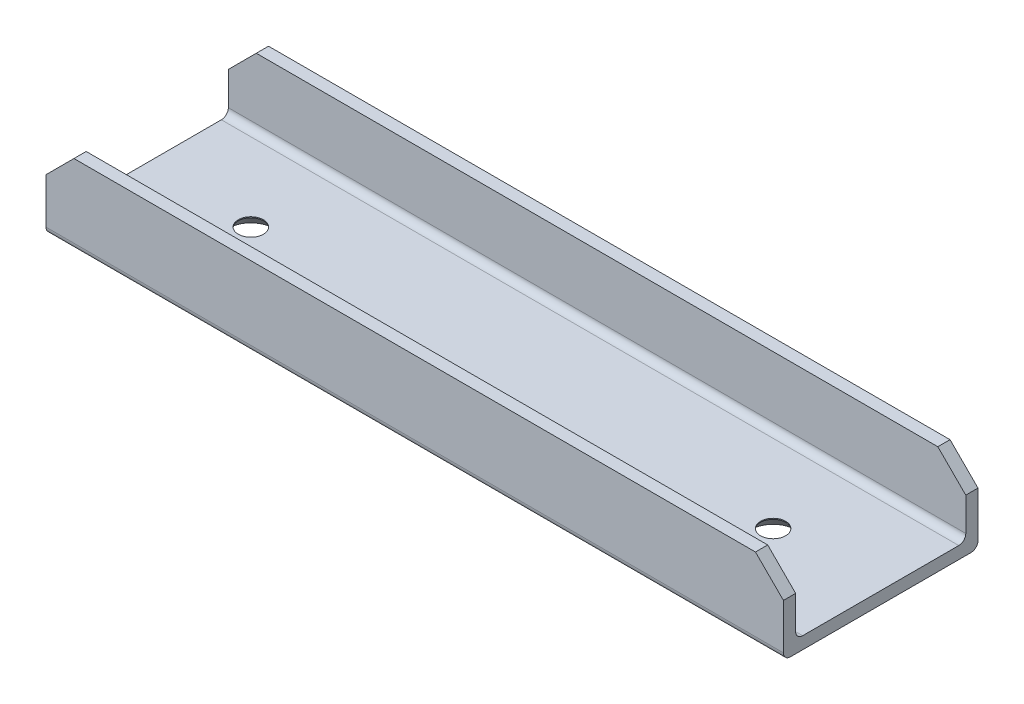
ISO-10303-21;
HEADER;
FILE_DESCRIPTION(('STEP AP214'),'2;1');
FILE_NAME('part.step','',(''),(''),'','','');
FILE_SCHEMA(('AUTOMOTIVE_DESIGN { 1 0 10303 214 1 1 1 1 }'));
ENDSEC;
DATA;
#1=APPLICATION_CONTEXT('core data for automotive mechanical design processes');
#2=APPLICATION_PROTOCOL_DEFINITION('international standard','automotive_design',2000,#1);
#3=PRODUCT_CONTEXT('',#1,'mechanical');
#4=PRODUCT('Part','Part','',(#3));
#5=PRODUCT_RELATED_PRODUCT_CATEGORY('part','',(#4));
#6=PRODUCT_DEFINITION_FORMATION('','',#4);
#7=PRODUCT_DEFINITION_CONTEXT('part definition',#1,'design');
#8=PRODUCT_DEFINITION('design','',#6,#7);
#9=PRODUCT_DEFINITION_SHAPE('','',#8);
#10=(LENGTH_UNIT() NAMED_UNIT(*) SI_UNIT(.MILLI.,.METRE.));
#11=(NAMED_UNIT(*) PLANE_ANGLE_UNIT() SI_UNIT($,.RADIAN.));
#12=(NAMED_UNIT(*) SI_UNIT($,.STERADIAN.) SOLID_ANGLE_UNIT());
#13=UNCERTAINTY_MEASURE_WITH_UNIT(LENGTH_MEASURE(1.E-05),#10,'distance_accuracy_value','');
#14=(GEOMETRIC_REPRESENTATION_CONTEXT(3) GLOBAL_UNCERTAINTY_ASSIGNED_CONTEXT((#13)) GLOBAL_UNIT_ASSIGNED_CONTEXT((#10,
#11,#12)) REPRESENTATION_CONTEXT('',''));
#15=CARTESIAN_POINT('',(0.,0.,0.));
#16=DIRECTION('',(0.,0.,1.));
#17=DIRECTION('',(1.,0.,0.));
#18=AXIS2_PLACEMENT_3D('',#15,#16,#17);
#19=CARTESIAN_POINT('',(0.,11.5,0.));
#20=DIRECTION('',(0.,-1.,0.));
#21=DIRECTION('',(0.,0.,-1.));
#22=AXIS2_PLACEMENT_3D('',#19,#20,#21);
#23=PLANE('',#22);
#24=DIRECTION('',(-1.,0.,0.));
#25=VECTOR('',#24,1.);
#26=CARTESIAN_POINT('',(-52.775,11.5,-13.925));
#27=LINE('',#26,#25);
#28=CARTESIAN_POINT('',(48.775,11.5,-13.925));
#29=VERTEX_POINT('',#28);
#30=CARTESIAN_POINT('',(-48.775,11.5,-13.925));
#31=VERTEX_POINT('',#30);
#32=EDGE_CURVE('E331',#29,#31,#27,.T.);
#33=ORIENTED_EDGE('',*,*,#32,.T.);
#34=DIRECTION('',(0.,0.,1.));
#35=VECTOR('',#34,1.);
#36=CARTESIAN_POINT('',(-48.775,11.5,0.));
#37=LINE('',#36,#35);
#38=CARTESIAN_POINT('',(-48.775,11.5,-12.175));
#39=VERTEX_POINT('',#38);
#40=EDGE_CURVE('E181',#31,#39,#37,.T.);
#41=ORIENTED_EDGE('',*,*,#40,.T.);
#42=DIRECTION('',(-1.,0.,0.));
#43=VECTOR('',#42,1.);
#44=CARTESIAN_POINT('',(-52.775,11.5,-12.175));
#45=LINE('',#44,#43);
#46=CARTESIAN_POINT('',(48.775,11.5,-12.175));
#47=VERTEX_POINT('',#46);
#48=EDGE_CURVE('E172',#47,#39,#45,.T.);
#49=ORIENTED_EDGE('',*,*,#48,.F.);
#50=DIRECTION('',(0.,0.,-1.));
#51=VECTOR('',#50,1.);
#52=CARTESIAN_POINT('',(48.775,11.5,0.));
#53=LINE('',#52,#51);
#54=EDGE_CURVE('E187',#47,#29,#53,.T.);
#55=ORIENTED_EDGE('',*,*,#54,.T.);
#56=EDGE_LOOP('',(#33,#41,#49,#55));
#57=FACE_BOUND('',#56,.T.);
#58=ADVANCED_FACE('F49',(#57),#23,.F.);
#59=CARTESIAN_POINT('',(52.775,11.5,13.925));
#60=DIRECTION('',(-1.,0.,0.));
#61=DIRECTION('',(0.,0.,1.));
#62=AXIS2_PLACEMENT_3D('',#59,#60,#61);
#63=PLANE('',#62);
#64=DIRECTION('',(0.,0.,-1.));
#65=VECTOR('',#64,1.);
#66=CARTESIAN_POINT('',(52.775,0.,13.925));
#67=LINE('',#66,#65);
#68=CARTESIAN_POINT('',(52.775,0.,12.925));
#69=VERTEX_POINT('',#68);
#70=CARTESIAN_POINT('',(52.775,0.,-12.925));
#71=VERTEX_POINT('',#70);
#72=EDGE_CURVE('E330',#69,#71,#67,.T.);
#73=ORIENTED_EDGE('',*,*,#72,.T.);
#74=CARTESIAN_POINT('',(52.775,1.,-12.925));
#75=DIRECTION('',(-1.,0.,0.));
#76=DIRECTION('',(0.,0.,1.));
#77=AXIS2_PLACEMENT_3D('',#74,#75,#76);
#78=CIRCLE('',#77,1.);
#79=CARTESIAN_POINT('',(52.775,1.,-13.925));
#80=VERTEX_POINT('',#79);
#81=EDGE_CURVE('E279',#71,#80,#78,.F.);
#82=ORIENTED_EDGE('',*,*,#81,.T.);
#83=DIRECTION('',(0.,-1.,0.));
#84=VECTOR('',#83,1.);
#85=CARTESIAN_POINT('',(52.775,11.5,-13.925));
#86=LINE('',#85,#84);
#87=CARTESIAN_POINT('',(52.775,7.50000000000001,-13.925));
#88=VERTEX_POINT('',#87);
#89=EDGE_CURVE('E197',#88,#80,#86,.T.);
#90=ORIENTED_EDGE('',*,*,#89,.F.);
#91=DIRECTION('',(0.,0.,1.));
#92=VECTOR('',#91,1.);
#93=CARTESIAN_POINT('',(52.775,7.50000000000001,13.925));
#94=LINE('',#93,#92);
#95=CARTESIAN_POINT('',(52.775,7.50000000000001,-12.175));
#96=VERTEX_POINT('',#95);
#97=EDGE_CURVE('E245',#88,#96,#94,.T.);
#98=ORIENTED_EDGE('',*,*,#97,.T.);
#99=DIRECTION('',(0.,1.,0.));
#100=VECTOR('',#99,1.);
#101=CARTESIAN_POINT('',(52.775,-108.322319953,-12.175));
#102=LINE('',#101,#100);
#103=CARTESIAN_POINT('',(52.775,2.75,-12.175));
#104=VERTEX_POINT('',#103);
#105=EDGE_CURVE('E174',#104,#96,#102,.T.);
#106=ORIENTED_EDGE('',*,*,#105,.F.);
#107=CARTESIAN_POINT('',(52.775,2.75,-11.175));
#108=DIRECTION('',(-1.,0.,0.));
#109=DIRECTION('',(0.,0.,1.));
#110=AXIS2_PLACEMENT_3D('',#107,#108,#109);
#111=CIRCLE('',#110,1.);
#112=CARTESIAN_POINT('',(52.775,1.75,-11.175));
#113=VERTEX_POINT('',#112);
#114=EDGE_CURVE('E288',#104,#113,#111,.T.);
#115=ORIENTED_EDGE('',*,*,#114,.T.);
#116=DIRECTION('',(0.,0.,-1.));
#117=VECTOR('',#116,1.);
#118=CARTESIAN_POINT('',(52.775,1.75,12.175));
#119=LINE('',#118,#117);
#120=CARTESIAN_POINT('',(52.775,1.75,11.175));
#121=VERTEX_POINT('',#120);
#122=EDGE_CURVE('E312',#121,#113,#119,.T.);
#123=ORIENTED_EDGE('',*,*,#122,.F.);
#124=CARTESIAN_POINT('',(52.775,2.75,11.175));
#125=DIRECTION('',(-1.,0.,0.));
#126=DIRECTION('',(0.,0.,1.));
#127=AXIS2_PLACEMENT_3D('',#124,#125,#126);
#128=CIRCLE('',#127,1.);
#129=CARTESIAN_POINT('',(52.775,2.75,12.175));
#130=VERTEX_POINT('',#129);
#131=EDGE_CURVE('E59',#121,#130,#128,.T.);
#132=ORIENTED_EDGE('',*,*,#131,.T.);
#133=DIRECTION('',(0.,1.,0.));
#134=VECTOR('',#133,1.);
#135=CARTESIAN_POINT('',(52.775,-108.322319953,12.175));
#136=LINE('',#135,#134);
#137=CARTESIAN_POINT('',(52.775,7.50000000000001,12.175));
#138=VERTEX_POINT('',#137);
#139=EDGE_CURVE('E316',#130,#138,#136,.T.);
#140=ORIENTED_EDGE('',*,*,#139,.T.);
#141=DIRECTION('',(0.,0.,1.));
#142=VECTOR('',#141,1.);
#143=CARTESIAN_POINT('',(52.775,7.50000000000001,13.925));
#144=LINE('',#143,#142);
#145=CARTESIAN_POINT('',(52.775,7.50000000000001,13.925));
#146=VERTEX_POINT('',#145);
#147=EDGE_CURVE('E242',#138,#146,#144,.T.);
#148=ORIENTED_EDGE('',*,*,#147,.T.);
#149=DIRECTION('',(0.,-1.,0.));
#150=VECTOR('',#149,1.);
#151=CARTESIAN_POINT('',(52.775,11.5,13.925));
#152=LINE('',#151,#150);
#153=CARTESIAN_POINT('',(52.775,1.,13.925));
#154=VERTEX_POINT('',#153);
#155=EDGE_CURVE('E339',#146,#154,#152,.T.);
#156=ORIENTED_EDGE('',*,*,#155,.T.);
#157=CARTESIAN_POINT('',(52.775,1.,12.925));
#158=DIRECTION('',(-1.,0.,0.));
#159=DIRECTION('',(0.,0.,1.));
#160=AXIS2_PLACEMENT_3D('',#157,#158,#159);
#161=CIRCLE('',#160,1.);
#162=EDGE_CURVE('E67',#154,#69,#161,.F.);
#163=ORIENTED_EDGE('',*,*,#162,.T.);
#164=EDGE_LOOP('',(#73,#82,#90,#98,#106,#115,#123,#132,#140,#148,#156,#163));
#165=FACE_BOUND('',#164,.T.);
#166=ADVANCED_FACE('F370',(#165),#63,.F.);
#167=CARTESIAN_POINT('',(-52.775,11.5,-13.925));
#168=DIRECTION('',(0.,0.,1.));
#169=DIRECTION('',(1.,0.,0.));
#170=AXIS2_PLACEMENT_3D('',#167,#168,#169);
#171=PLANE('',#170);
#172=ORIENTED_EDGE('',*,*,#89,.T.);
#173=DIRECTION('',(-1.,0.,0.));
#174=VECTOR('',#173,1.);
#175=CARTESIAN_POINT('',(-52.775,1.,-13.925));
#176=LINE('',#175,#174);
#177=CARTESIAN_POINT('',(-52.775,1.,-13.925));
#178=VERTEX_POINT('',#177);
#179=EDGE_CURVE('E262',#80,#178,#176,.T.);
#180=ORIENTED_EDGE('',*,*,#179,.T.);
#181=DIRECTION('',(0.,-1.,0.));
#182=VECTOR('',#181,1.);
#183=CARTESIAN_POINT('',(-52.775,11.5,-13.925));
#184=LINE('',#183,#182);
#185=CARTESIAN_POINT('',(-52.775,7.50000000000001,-13.925));
#186=VERTEX_POINT('',#185);
#187=EDGE_CURVE('E203',#186,#178,#184,.T.);
#188=ORIENTED_EDGE('',*,*,#187,.F.);
#189=DIRECTION('',(-0.707106781186546,-0.707106781186549,0.));
#190=VECTOR('',#189,1.);
#191=CARTESIAN_POINT('',(-48.775,11.5,-13.925));
#192=LINE('',#191,#190);
#193=EDGE_CURVE('E218',#186,#31,#192,.F.);
#194=ORIENTED_EDGE('',*,*,#193,.T.);
#195=ORIENTED_EDGE('',*,*,#32,.F.);
#196=DIRECTION('',(-0.707106781186546,0.707106781186549,0.));
#197=VECTOR('',#196,1.);
#198=CARTESIAN_POINT('',(48.775,11.5,-13.925));
#199=LINE('',#198,#197);
#200=EDGE_CURVE('E195',#29,#88,#199,.F.);
#201=ORIENTED_EDGE('',*,*,#200,.T.);
#202=EDGE_LOOP('',(#172,#180,#188,#194,#195,#201));
#203=FACE_BOUND('',#202,.T.);
#204=ADVANCED_FACE('F359',(#203),#171,.F.);
#205=CARTESIAN_POINT('',(-52.775,11.5,13.925));
#206=DIRECTION('',(1.,0.,0.));
#207=DIRECTION('',(0.,0.,-1.));
#208=AXIS2_PLACEMENT_3D('',#205,#206,#207);
#209=PLANE('',#208);
#210=ORIENTED_EDGE('',*,*,#187,.T.);
#211=CARTESIAN_POINT('',(-52.775,1.,-12.925));
#212=DIRECTION('',(1.,0.,0.));
#213=DIRECTION('',(0.,0.,-1.));
#214=AXIS2_PLACEMENT_3D('',#211,#212,#213);
#215=CIRCLE('',#214,1.);
#216=CARTESIAN_POINT('',(-52.775,0.,-12.925));
#217=VERTEX_POINT('',#216);
#218=EDGE_CURVE('E269',#178,#217,#215,.F.);
#219=ORIENTED_EDGE('',*,*,#218,.T.);
#220=DIRECTION('',(0.,0.,1.));
#221=VECTOR('',#220,1.);
#222=CARTESIAN_POINT('',(-52.775,0.,13.925));
#223=LINE('',#222,#221);
#224=CARTESIAN_POINT('',(-52.775,0.,12.925));
#225=VERTEX_POINT('',#224);
#226=EDGE_CURVE('E335',#217,#225,#223,.T.);
#227=ORIENTED_EDGE('',*,*,#226,.T.);
#228=CARTESIAN_POINT('',(-52.775,1.,12.925));
#229=DIRECTION('',(1.,0.,0.));
#230=DIRECTION('',(0.,0.,-1.));
#231=AXIS2_PLACEMENT_3D('',#228,#229,#230);
#232=CIRCLE('',#231,1.);
#233=CARTESIAN_POINT('',(-52.775,1.,13.925));
#234=VERTEX_POINT('',#233);
#235=EDGE_CURVE('E266',#225,#234,#232,.F.);
#236=ORIENTED_EDGE('',*,*,#235,.T.);
#237=DIRECTION('',(0.,-1.,0.));
#238=VECTOR('',#237,1.);
#239=CARTESIAN_POINT('',(-52.775,11.5,13.925));
#240=LINE('',#239,#238);
#241=CARTESIAN_POINT('',(-52.775,7.50000000000001,13.925));
#242=VERTEX_POINT('',#241);
#243=EDGE_CURVE('E348',#242,#234,#240,.T.);
#244=ORIENTED_EDGE('',*,*,#243,.F.);
#245=DIRECTION('',(0.,0.,-1.));
#246=VECTOR('',#245,1.);
#247=CARTESIAN_POINT('',(-52.775,7.50000000000001,13.925));
#248=LINE('',#247,#246);
#249=CARTESIAN_POINT('',(-52.775,7.50000000000001,12.175));
#250=VERTEX_POINT('',#249);
#251=EDGE_CURVE('E209',#242,#250,#248,.T.);
#252=ORIENTED_EDGE('',*,*,#251,.T.);
#253=DIRECTION('',(0.,1.,0.));
#254=VECTOR('',#253,1.);
#255=CARTESIAN_POINT('',(-52.775,-108.322319953,12.175));
#256=LINE('',#255,#254);
#257=CARTESIAN_POINT('',(-52.775,2.75,12.175));
#258=VERTEX_POINT('',#257);
#259=EDGE_CURVE('E321',#258,#250,#256,.T.);
#260=ORIENTED_EDGE('',*,*,#259,.F.);
#261=CARTESIAN_POINT('',(-52.775,2.75,11.175));
#262=DIRECTION('',(1.,0.,0.));
#263=DIRECTION('',(0.,0.,-1.));
#264=AXIS2_PLACEMENT_3D('',#261,#262,#263);
#265=CIRCLE('',#264,1.);
#266=CARTESIAN_POINT('',(-52.775,1.75,11.175));
#267=VERTEX_POINT('',#266);
#268=EDGE_CURVE('E12',#258,#267,#265,.T.);
#269=ORIENTED_EDGE('',*,*,#268,.T.);
#270=DIRECTION('',(0.,0.,1.));
#271=VECTOR('',#270,1.);
#272=CARTESIAN_POINT('',(-52.775,1.75,12.175));
#273=LINE('',#272,#271);
#274=CARTESIAN_POINT('',(-52.775,1.75,-11.175));
#275=VERTEX_POINT('',#274);
#276=EDGE_CURVE('E317',#275,#267,#273,.T.);
#277=ORIENTED_EDGE('',*,*,#276,.F.);
#278=CARTESIAN_POINT('',(-52.775,2.75,-11.175));
#279=DIRECTION('',(1.,0.,0.));
#280=DIRECTION('',(0.,0.,-1.));
#281=AXIS2_PLACEMENT_3D('',#278,#279,#280);
#282=CIRCLE('',#281,1.);
#283=CARTESIAN_POINT('',(-52.775,2.75,-12.175));
#284=VERTEX_POINT('',#283);
#285=EDGE_CURVE('E285',#275,#284,#282,.T.);
#286=ORIENTED_EDGE('',*,*,#285,.T.);
#287=DIRECTION('',(0.,1.,0.));
#288=VECTOR('',#287,1.);
#289=CARTESIAN_POINT('',(-52.775,-108.322319953,-12.175));
#290=LINE('',#289,#288);
#291=CARTESIAN_POINT('',(-52.775,7.50000000000001,-12.175));
#292=VERTEX_POINT('',#291);
#293=EDGE_CURVE('E310',#284,#292,#290,.T.);
#294=ORIENTED_EDGE('',*,*,#293,.T.);
#295=DIRECTION('',(0.,0.,-1.));
#296=VECTOR('',#295,1.);
#297=CARTESIAN_POINT('',(-52.775,7.50000000000001,13.925));
#298=LINE('',#297,#296);
#299=EDGE_CURVE('E213',#292,#186,#298,.T.);
#300=ORIENTED_EDGE('',*,*,#299,.T.);
#301=EDGE_LOOP('',(#210,#219,#227,#236,#244,#252,#260,#269,#277,#286,#294,#300));
#302=FACE_BOUND('',#301,.T.);
#303=ADVANCED_FACE('F355',(#302),#209,.F.);
#304=CARTESIAN_POINT('',(-52.775,11.5,13.925));
#305=DIRECTION('',(0.,0.,-1.));
#306=DIRECTION('',(-1.,0.,0.));
#307=AXIS2_PLACEMENT_3D('',#304,#305,#306);
#308=PLANE('',#307);
#309=ORIENTED_EDGE('',*,*,#243,.T.);
#310=DIRECTION('',(1.,0.,0.));
#311=VECTOR('',#310,1.);
#312=CARTESIAN_POINT('',(52.775,1.,13.925));
#313=LINE('',#312,#311);
#314=EDGE_CURVE('E282',#234,#154,#313,.T.);
#315=ORIENTED_EDGE('',*,*,#314,.T.);
#316=ORIENTED_EDGE('',*,*,#155,.F.);
#317=DIRECTION('',(0.707106781186546,-0.707106781186549,0.));
#318=VECTOR('',#317,1.);
#319=CARTESIAN_POINT('',(48.775,11.5,13.925));
#320=LINE('',#319,#318);
#321=CARTESIAN_POINT('',(48.775,11.5,13.925));
#322=VERTEX_POINT('',#321);
#323=EDGE_CURVE('E229',#146,#322,#320,.F.);
#324=ORIENTED_EDGE('',*,*,#323,.T.);
#325=DIRECTION('',(1.,0.,0.));
#326=VECTOR('',#325,1.);
#327=CARTESIAN_POINT('',(-52.775,11.5,13.925));
#328=LINE('',#327,#326);
#329=CARTESIAN_POINT('',(-48.775,11.5,13.925));
#330=VERTEX_POINT('',#329);
#331=EDGE_CURVE('E334',#330,#322,#328,.T.);
#332=ORIENTED_EDGE('',*,*,#331,.F.);
#333=DIRECTION('',(0.707106781186546,0.707106781186549,0.));
#334=VECTOR('',#333,1.);
#335=CARTESIAN_POINT('',(-48.775,11.5,13.925));
#336=LINE('',#335,#334);
#337=EDGE_CURVE('E232',#330,#242,#336,.F.);
#338=ORIENTED_EDGE('',*,*,#337,.T.);
#339=EDGE_LOOP('',(#309,#315,#316,#324,#332,#338));
#340=FACE_BOUND('',#339,.T.);
#341=ADVANCED_FACE('F391',(#340),#308,.F.);
#342=DIRECTION('',(1.,0.,0.));
#343=VECTOR('',#342,1.);
#344=CARTESIAN_POINT('',(-52.775,11.5,12.175));
#345=LINE('',#344,#343);
#346=CARTESIAN_POINT('',(-48.775,11.5,12.175));
#347=VERTEX_POINT('',#346);
#348=CARTESIAN_POINT('',(48.775,11.5,12.175));
#349=VERTEX_POINT('',#348);
#350=EDGE_CURVE('E191',#347,#349,#345,.T.);
#351=ORIENTED_EDGE('',*,*,#350,.F.);
#352=DIRECTION('',(0.,0.,1.));
#353=VECTOR('',#352,1.);
#354=CARTESIAN_POINT('',(-48.775,11.5,0.));
#355=LINE('',#354,#353);
#356=EDGE_CURVE('E225',#347,#330,#355,.T.);
#357=ORIENTED_EDGE('',*,*,#356,.T.);
#358=ORIENTED_EDGE('',*,*,#331,.T.);
#359=DIRECTION('',(0.,0.,-1.));
#360=VECTOR('',#359,1.);
#361=CARTESIAN_POINT('',(48.775,11.5,0.));
#362=LINE('',#361,#360);
#363=EDGE_CURVE('E221',#322,#349,#362,.T.);
#364=ORIENTED_EDGE('',*,*,#363,.T.);
#365=EDGE_LOOP('',(#351,#357,#358,#364));
#366=FACE_BOUND('',#365,.T.);
#367=ADVANCED_FACE('F410',(#366),#23,.F.);
#368=CARTESIAN_POINT('',(0.,0.,0.));
#369=DIRECTION('',(0.,-1.,0.));
#370=DIRECTION('',(0.,0.,-1.));
#371=AXIS2_PLACEMENT_3D('',#368,#369,#370);
#372=PLANE('',#371);
#373=CARTESIAN_POINT('',(-37.375,0.,0.));
#374=DIRECTION('',(0.,-1.,0.));
#375=DIRECTION('',(0.,0.,-1.));
#376=AXIS2_PLACEMENT_3D('',#373,#374,#375);
#377=CIRCLE('',#376,3.2);
#378=CARTESIAN_POINT('',(-37.375,0.,-3.2));
#379=VERTEX_POINT('',#378);
#380=EDGE_CURVE('E530',#379,#379,#377,.T.);
#381=ORIENTED_EDGE('',*,*,#380,.F.);
#382=EDGE_LOOP('',(#381));
#383=FACE_BOUND('',#382,.T.);
#384=CARTESIAN_POINT('',(37.375,0.,0.));
#385=DIRECTION('',(0.,-1.,0.));
#386=DIRECTION('',(0.,0.,-1.));
#387=AXIS2_PLACEMENT_3D('',#384,#385,#386);
#388=CIRCLE('',#387,3.2);
#389=CARTESIAN_POINT('',(37.375,0.,-3.2));
#390=VERTEX_POINT('',#389);
#391=EDGE_CURVE('E299',#390,#390,#388,.T.);
#392=ORIENTED_EDGE('',*,*,#391,.F.);
#393=EDGE_LOOP('',(#392));
#394=FACE_BOUND('',#393,.T.);
#395=ORIENTED_EDGE('',*,*,#226,.F.);
#396=DIRECTION('',(-1.,0.,0.));
#397=VECTOR('',#396,1.);
#398=CARTESIAN_POINT('',(52.775,0.,-12.925));
#399=LINE('',#398,#397);
#400=EDGE_CURVE('E75',#217,#71,#399,.F.);
#401=ORIENTED_EDGE('',*,*,#400,.T.);
#402=ORIENTED_EDGE('',*,*,#72,.F.);
#403=DIRECTION('',(1.,0.,0.));
#404=VECTOR('',#403,1.);
#405=CARTESIAN_POINT('',(-52.775,0.,12.925));
#406=LINE('',#405,#404);
#407=EDGE_CURVE('E272',#69,#225,#406,.F.);
#408=ORIENTED_EDGE('',*,*,#407,.T.);
#409=EDGE_LOOP('',(#395,#401,#402,#408));
#410=FACE_BOUND('',#409,.T.);
#411=ADVANCED_FACE('F396',(#383,#394,#410),#372,.T.);
#412=CARTESIAN_POINT('',(0.,1.75,0.));
#413=DIRECTION('',(0.,-1.,0.));
#414=DIRECTION('',(0.,0.,-1.));
#415=AXIS2_PLACEMENT_3D('',#412,#413,#414);
#416=PLANE('',#415);
#417=CARTESIAN_POINT('',(-37.375,1.75,0.));
#418=DIRECTION('',(0.,-1.,0.));
#419=DIRECTION('',(0.,0.,-1.));
#420=AXIS2_PLACEMENT_3D('',#417,#418,#419);
#421=CIRCLE('',#420,1.8);
#422=CARTESIAN_POINT('',(-37.375,1.75,-1.8));
#423=VERTEX_POINT('',#422);
#424=EDGE_CURVE('E53',#423,#423,#421,.T.);
#425=ORIENTED_EDGE('',*,*,#424,.T.);
#426=EDGE_LOOP('',(#425));
#427=FACE_BOUND('',#426,.T.);
#428=CARTESIAN_POINT('',(37.375,1.75,0.));
#429=DIRECTION('',(0.,-1.,0.));
#430=DIRECTION('',(0.,0.,-1.));
#431=AXIS2_PLACEMENT_3D('',#428,#429,#430);
#432=CIRCLE('',#431,1.8);
#433=CARTESIAN_POINT('',(37.375,1.75,-1.8));
#434=VERTEX_POINT('',#433);
#435=EDGE_CURVE('E192',#434,#434,#432,.T.);
#436=ORIENTED_EDGE('',*,*,#435,.T.);
#437=EDGE_LOOP('',(#436));
#438=FACE_BOUND('',#437,.T.);
#439=ORIENTED_EDGE('',*,*,#122,.T.);
#440=DIRECTION('',(-1.,0.,0.));
#441=VECTOR('',#440,1.);
#442=CARTESIAN_POINT('',(-52.775,1.75,-11.175));
#443=LINE('',#442,#441);
#444=EDGE_CURVE('E252',#113,#275,#443,.T.);
#445=ORIENTED_EDGE('',*,*,#444,.T.);
#446=ORIENTED_EDGE('',*,*,#276,.T.);
#447=DIRECTION('',(1.,0.,0.));
#448=VECTOR('',#447,1.);
#449=CARTESIAN_POINT('',(52.775,1.75,11.175));
#450=LINE('',#449,#448);
#451=EDGE_CURVE('E248',#267,#121,#450,.T.);
#452=ORIENTED_EDGE('',*,*,#451,.T.);
#453=EDGE_LOOP('',(#439,#445,#446,#452));
#454=FACE_BOUND('',#453,.T.);
#455=ADVANCED_FACE('F372',(#427,#438,#454),#416,.F.);
#456=CARTESIAN_POINT('',(-52.775,-108.322319953,-12.175));
#457=DIRECTION('',(0.,0.,-1.));
#458=DIRECTION('',(-1.,0.,0.));
#459=AXIS2_PLACEMENT_3D('',#456,#457,#458);
#460=PLANE('',#459);
#461=ORIENTED_EDGE('',*,*,#293,.F.);
#462=DIRECTION('',(-1.,0.,0.));
#463=VECTOR('',#462,1.);
#464=CARTESIAN_POINT('',(52.775,2.75,-12.175));
#465=LINE('',#464,#463);
#466=EDGE_CURVE('E256',#284,#104,#465,.F.);
#467=ORIENTED_EDGE('',*,*,#466,.T.);
#468=ORIENTED_EDGE('',*,*,#105,.T.);
#469=DIRECTION('',(0.707106781186546,-0.707106781186549,0.));
#470=VECTOR('',#469,1.);
#471=CARTESIAN_POINT('',(48.775,11.5,-12.175));
#472=LINE('',#471,#470);
#473=EDGE_CURVE('E167',#96,#47,#472,.F.);
#474=ORIENTED_EDGE('',*,*,#473,.T.);
#475=ORIENTED_EDGE('',*,*,#48,.T.);
#476=DIRECTION('',(0.707106781186546,0.707106781186549,0.));
#477=VECTOR('',#476,1.);
#478=CARTESIAN_POINT('',(-48.775,11.5,-12.175));
#479=LINE('',#478,#477);
#480=EDGE_CURVE('E180',#39,#292,#479,.F.);
#481=ORIENTED_EDGE('',*,*,#480,.T.);
#482=EDGE_LOOP('',(#461,#467,#468,#474,#475,#481));
#483=FACE_BOUND('',#482,.T.);
#484=ADVANCED_FACE('F170',(#483),#460,.F.);
#485=CARTESIAN_POINT('',(-52.775,-108.322319953,12.175));
#486=DIRECTION('',(0.,0.,1.));
#487=DIRECTION('',(1.,0.,0.));
#488=AXIS2_PLACEMENT_3D('',#485,#486,#487);
#489=PLANE('',#488);
#490=ORIENTED_EDGE('',*,*,#139,.F.);
#491=DIRECTION('',(1.,0.,0.));
#492=VECTOR('',#491,1.);
#493=CARTESIAN_POINT('',(-52.775,2.75,12.175));
#494=LINE('',#493,#492);
#495=EDGE_CURVE('E259',#130,#258,#494,.F.);
#496=ORIENTED_EDGE('',*,*,#495,.T.);
#497=ORIENTED_EDGE('',*,*,#259,.T.);
#498=DIRECTION('',(-0.707106781186546,-0.707106781186549,0.));
#499=VECTOR('',#498,1.);
#500=CARTESIAN_POINT('',(-48.775,11.5,12.175));
#501=LINE('',#500,#499);
#502=EDGE_CURVE('E239',#250,#347,#501,.F.);
#503=ORIENTED_EDGE('',*,*,#502,.T.);
#504=ORIENTED_EDGE('',*,*,#350,.T.);
#505=DIRECTION('',(-0.707106781186546,0.707106781186549,0.));
#506=VECTOR('',#505,1.);
#507=CARTESIAN_POINT('',(48.775,11.5,12.175));
#508=LINE('',#507,#506);
#509=EDGE_CURVE('E235',#349,#138,#508,.F.);
#510=ORIENTED_EDGE('',*,*,#509,.T.);
#511=EDGE_LOOP('',(#490,#496,#497,#503,#504,#510));
#512=FACE_BOUND('',#511,.T.);
#513=ADVANCED_FACE('F381',(#512),#489,.F.);
#514=CARTESIAN_POINT('',(-48.775,11.5,0.));
#515=DIRECTION('',(0.707106781186549,-0.707106781186546,0.));
#516=DIRECTION('',(0.,0.,1.));
#517=AXIS2_PLACEMENT_3D('',#514,#515,#516);
#518=PLANE('',#517);
#519=ORIENTED_EDGE('',*,*,#193,.F.);
#520=ORIENTED_EDGE('',*,*,#299,.F.);
#521=ORIENTED_EDGE('',*,*,#480,.F.);
#522=ORIENTED_EDGE('',*,*,#40,.F.);
#523=EDGE_LOOP('',(#519,#520,#521,#522));
#524=FACE_BOUND('',#523,.T.);
#525=ADVANCED_FACE('F362',(#524),#518,.F.);
#526=CARTESIAN_POINT('',(-48.775,11.5,0.));
#527=DIRECTION('',(0.707106781186549,-0.707106781186546,0.));
#528=DIRECTION('',(0.,0.,1.));
#529=AXIS2_PLACEMENT_3D('',#526,#527,#528);
#530=PLANE('',#529);
#531=ORIENTED_EDGE('',*,*,#502,.F.);
#532=ORIENTED_EDGE('',*,*,#251,.F.);
#533=ORIENTED_EDGE('',*,*,#337,.F.);
#534=ORIENTED_EDGE('',*,*,#356,.F.);
#535=EDGE_LOOP('',(#531,#532,#533,#534));
#536=FACE_BOUND('',#535,.T.);
#537=ADVANCED_FACE('F429',(#536),#530,.F.);
#538=CARTESIAN_POINT('',(48.775,11.5,0.));
#539=DIRECTION('',(-0.707106781186549,-0.707106781186546,0.));
#540=DIRECTION('',(0.,0.,-1.));
#541=AXIS2_PLACEMENT_3D('',#538,#539,#540);
#542=PLANE('',#541);
#543=ORIENTED_EDGE('',*,*,#473,.F.);
#544=ORIENTED_EDGE('',*,*,#97,.F.);
#545=ORIENTED_EDGE('',*,*,#200,.F.);
#546=ORIENTED_EDGE('',*,*,#54,.F.);
#547=EDGE_LOOP('',(#543,#544,#545,#546));
#548=FACE_BOUND('',#547,.T.);
#549=ADVANCED_FACE('F194',(#548),#542,.F.);
#550=CARTESIAN_POINT('',(48.775,11.5,0.));
#551=DIRECTION('',(-0.707106781186549,-0.707106781186546,0.));
#552=DIRECTION('',(0.,0.,-1.));
#553=AXIS2_PLACEMENT_3D('',#550,#551,#552);
#554=PLANE('',#553);
#555=ORIENTED_EDGE('',*,*,#323,.F.);
#556=ORIENTED_EDGE('',*,*,#147,.F.);
#557=ORIENTED_EDGE('',*,*,#509,.F.);
#558=ORIENTED_EDGE('',*,*,#363,.F.);
#559=EDGE_LOOP('',(#555,#556,#557,#558));
#560=FACE_BOUND('',#559,.T.);
#561=ADVANCED_FACE('F388',(#560),#554,.F.);
#562=CARTESIAN_POINT('',(0.,2.75,-11.175));
#563=DIRECTION('',(1.,0.,0.));
#564=DIRECTION('',(0.,0.,-1.));
#565=AXIS2_PLACEMENT_3D('',#562,#563,#564);
#566=CYLINDRICAL_SURFACE('',#565,1.);
#567=ORIENTED_EDGE('',*,*,#114,.F.);
#568=ORIENTED_EDGE('',*,*,#466,.F.);
#569=ORIENTED_EDGE('',*,*,#285,.F.);
#570=ORIENTED_EDGE('',*,*,#444,.F.);
#571=EDGE_LOOP('',(#567,#568,#569,#570));
#572=FACE_BOUND('',#571,.T.);
#573=ADVANCED_FACE('F366',(#572),#566,.F.);
#574=CARTESIAN_POINT('',(0.,2.75,11.175));
#575=DIRECTION('',(-1.,0.,0.));
#576=DIRECTION('',(0.,0.,1.));
#577=AXIS2_PLACEMENT_3D('',#574,#575,#576);
#578=CYLINDRICAL_SURFACE('',#577,1.);
#579=ORIENTED_EDGE('',*,*,#268,.F.);
#580=ORIENTED_EDGE('',*,*,#495,.F.);
#581=ORIENTED_EDGE('',*,*,#131,.F.);
#582=ORIENTED_EDGE('',*,*,#451,.F.);
#583=EDGE_LOOP('',(#579,#580,#581,#582));
#584=FACE_BOUND('',#583,.T.);
#585=ADVANCED_FACE('F377',(#584),#578,.F.);
#586=CARTESIAN_POINT('',(-52.775,1.,-12.925));
#587=DIRECTION('',(1.,0.,0.));
#588=DIRECTION('',(0.,0.,-1.));
#589=AXIS2_PLACEMENT_3D('',#586,#587,#588);
#590=CYLINDRICAL_SURFACE('',#589,1.);
#591=ORIENTED_EDGE('',*,*,#81,.F.);
#592=ORIENTED_EDGE('',*,*,#400,.F.);
#593=ORIENTED_EDGE('',*,*,#218,.F.);
#594=ORIENTED_EDGE('',*,*,#179,.F.);
#595=EDGE_LOOP('',(#591,#592,#593,#594));
#596=FACE_BOUND('',#595,.T.);
#597=ADVANCED_FACE('F399',(#596),#590,.T.);
#598=CARTESIAN_POINT('',(-52.775,1.,12.925));
#599=DIRECTION('',(-1.,0.,0.));
#600=DIRECTION('',(0.,0.,1.));
#601=AXIS2_PLACEMENT_3D('',#598,#599,#600);
#602=CYLINDRICAL_SURFACE('',#601,1.);
#603=ORIENTED_EDGE('',*,*,#235,.F.);
#604=ORIENTED_EDGE('',*,*,#407,.F.);
#605=ORIENTED_EDGE('',*,*,#162,.F.);
#606=ORIENTED_EDGE('',*,*,#314,.F.);
#607=EDGE_LOOP('',(#603,#604,#605,#606));
#608=FACE_BOUND('',#607,.T.);
#609=ADVANCED_FACE('F51',(#608),#602,.T.);
#610=CARTESIAN_POINT('',(37.375,0.,0.));
#611=DIRECTION('',(0.,-1.,0.));
#612=DIRECTION('',(0.,0.,-1.));
#613=AXIS2_PLACEMENT_3D('',#610,#611,#612);
#614=CYLINDRICAL_SURFACE('',#613,1.8);
#615=CARTESIAN_POINT('',(37.375,1.61051577010941,0.));
#616=DIRECTION('',(0.,-1.,0.));
#617=DIRECTION('',(0.,0.,-1.));
#618=AXIS2_PLACEMENT_3D('',#615,#616,#617);
#619=CIRCLE('',#618,1.8);
#620=CARTESIAN_POINT('',(37.375,1.61051577010941,-1.8));
#621=VERTEX_POINT('',#620);
#622=EDGE_CURVE('E294',#621,#621,#619,.T.);
#623=ORIENTED_EDGE('',*,*,#622,.T.);
#624=EDGE_LOOP('',(#623));
#625=FACE_BOUND('',#624,.T.);
#626=ORIENTED_EDGE('',*,*,#435,.F.);
#627=EDGE_LOOP('',(#626));
#628=FACE_BOUND('',#627,.T.);
#629=ADVANCED_FACE('F406',(#625,#628),#614,.F.);
#630=CARTESIAN_POINT('',(37.375,0.,0.));
#631=DIRECTION('',(0.,-1.,0.));
#632=DIRECTION('',(0.,0.,-1.));
#633=AXIS2_PLACEMENT_3D('',#630,#631,#632);
#634=CONICAL_SURFACE('',#633,3.2,0.715584993317676);
#635=ORIENTED_EDGE('',*,*,#622,.F.);
#636=EDGE_LOOP('',(#635));
#637=FACE_BOUND('',#636,.T.);
#638=ORIENTED_EDGE('',*,*,#391,.T.);
#639=EDGE_LOOP('',(#638));
#640=FACE_BOUND('',#639,.T.);
#641=ADVANCED_FACE('F483',(#637,#640),#634,.F.);
#642=CARTESIAN_POINT('',(-37.375,0.,0.));
#643=DIRECTION('',(0.,-1.,0.));
#644=DIRECTION('',(0.,0.,-1.));
#645=AXIS2_PLACEMENT_3D('',#642,#643,#644);
#646=CYLINDRICAL_SURFACE('',#645,1.8);
#647=CARTESIAN_POINT('',(-37.375,1.61051577010941,0.));
#648=DIRECTION('',(0.,-1.,0.));
#649=DIRECTION('',(0.,0.,-1.));
#650=AXIS2_PLACEMENT_3D('',#647,#648,#649);
#651=CIRCLE('',#650,1.8);
#652=CARTESIAN_POINT('',(-37.375,1.61051577010941,-1.8));
#653=VERTEX_POINT('',#652);
#654=EDGE_CURVE('E527',#653,#653,#651,.T.);
#655=ORIENTED_EDGE('',*,*,#654,.T.);
#656=EDGE_LOOP('',(#655));
#657=FACE_BOUND('',#656,.T.);
#658=ORIENTED_EDGE('',*,*,#424,.F.);
#659=EDGE_LOOP('',(#658));
#660=FACE_BOUND('',#659,.T.);
#661=ADVANCED_FACE('F493',(#657,#660),#646,.F.);
#662=CARTESIAN_POINT('',(-37.375,0.,0.));
#663=DIRECTION('',(0.,-1.,0.));
#664=DIRECTION('',(0.,0.,-1.));
#665=AXIS2_PLACEMENT_3D('',#662,#663,#664);
#666=CONICAL_SURFACE('',#665,3.2,0.715584993317676);
#667=ORIENTED_EDGE('',*,*,#654,.F.);
#668=EDGE_LOOP('',(#667));
#669=FACE_BOUND('',#668,.T.);
#670=ORIENTED_EDGE('',*,*,#380,.T.);
#671=EDGE_LOOP('',(#670));
#672=FACE_BOUND('',#671,.T.);
#673=ADVANCED_FACE('F503',(#669,#672),#666,.F.);
#674=CLOSED_SHELL('',(#58,#166,#204,#303,#341,#367,#411,#455,#484,#513,#525,#537,#549,#561,#573,
#585,#597,#609,#629,#641,#661,#673));
#675=MANIFOLD_SOLID_BREP('B2',#674);
#676=ADVANCED_BREP_SHAPE_REPRESENTATION('',(#18,#675),#14);
#677=SHAPE_DEFINITION_REPRESENTATION(#9,#676);
ENDSEC;
END-ISO-10303-21;
